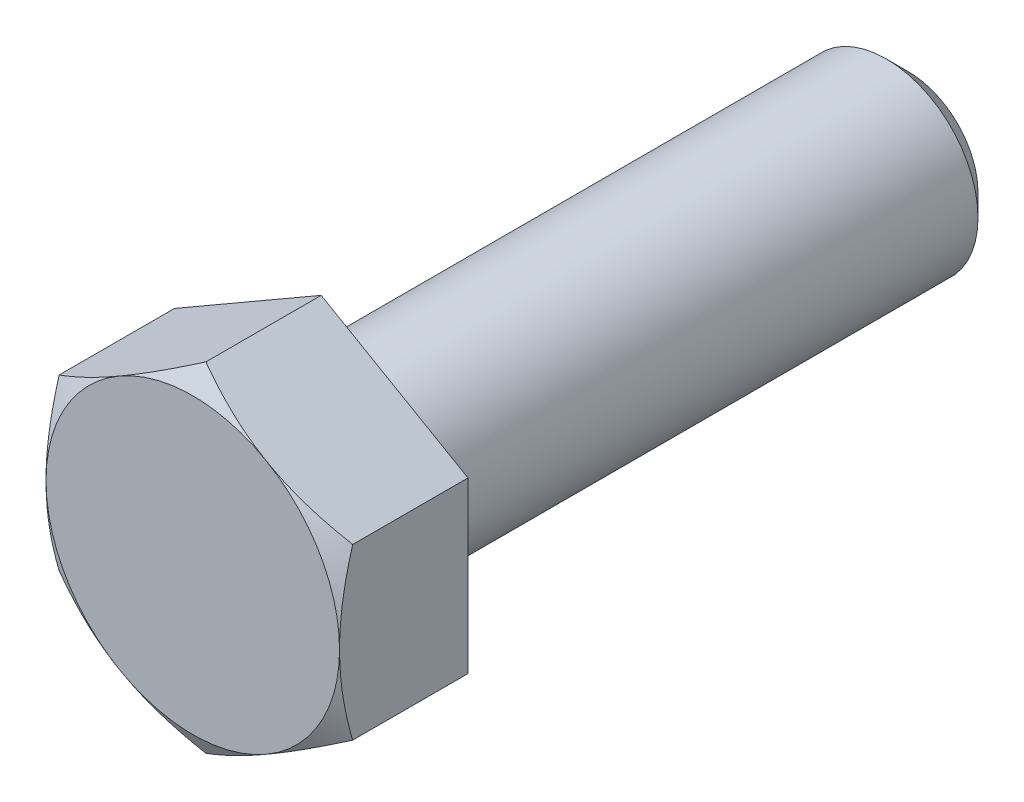
ISO-10303-21;
HEADER;
FILE_DESCRIPTION(('STEP AP214'),'2;1');
FILE_NAME('part.step','',(''),(''),'','','');
FILE_SCHEMA(('AUTOMOTIVE_DESIGN { 1 0 10303 214 1 1 1 1 }'));
ENDSEC;
DATA;
#1=APPLICATION_CONTEXT('core data for automotive mechanical design processes');
#2=APPLICATION_PROTOCOL_DEFINITION('international standard','automotive_design',2000,#1);
#3=PRODUCT_CONTEXT('',#1,'mechanical');
#4=PRODUCT('Part','Part','',(#3));
#5=PRODUCT_RELATED_PRODUCT_CATEGORY('part','',(#4));
#6=PRODUCT_DEFINITION_FORMATION('','',#4);
#7=PRODUCT_DEFINITION_CONTEXT('part definition',#1,'design');
#8=PRODUCT_DEFINITION('design','',#6,#7);
#9=PRODUCT_DEFINITION_SHAPE('','',#8);
#10=(LENGTH_UNIT() NAMED_UNIT(*) SI_UNIT(.MILLI.,.METRE.));
#11=(NAMED_UNIT(*) PLANE_ANGLE_UNIT() SI_UNIT($,.RADIAN.));
#12=(NAMED_UNIT(*) SI_UNIT($,.STERADIAN.) SOLID_ANGLE_UNIT());
#13=UNCERTAINTY_MEASURE_WITH_UNIT(LENGTH_MEASURE(1.E-05),#10,'distance_accuracy_value','');
#14=(GEOMETRIC_REPRESENTATION_CONTEXT(3) GLOBAL_UNCERTAINTY_ASSIGNED_CONTEXT((#13)) GLOBAL_UNIT_ASSIGNED_CONTEXT((#10,
#11,#12)) REPRESENTATION_CONTEXT('',''));
#15=CARTESIAN_POINT('',(0.,0.,0.));
#16=DIRECTION('',(0.,0.,1.));
#17=DIRECTION('',(1.,0.,0.));
#18=AXIS2_PLACEMENT_3D('',#15,#16,#17);
#19=CARTESIAN_POINT('',(3.99999999999999,2.30940107675851,-5.97020185321558));
#20=DIRECTION('',(0.5,0.866025403784439,0.));
#21=DIRECTION('',(-0.866025403784439,0.5,0.));
#22=AXIS2_PLACEMENT_3D('',#19,#20,#21);
#23=PLANE('',#22);
#24=DIRECTION('',(0.,0.,1.));
#25=VECTOR('',#24,1.);
#26=CARTESIAN_POINT('',(0.,4.61880215351701,-5.97020185321558));
#27=LINE('',#26,#25);
#28=CARTESIAN_POINT('',(0.,4.61880215351701,6.24999999999999));
#29=VERTEX_POINT('',#28);
#30=CARTESIAN_POINT('',(0.,4.61880215351701,9.39273441009183));
#31=VERTEX_POINT('',#30);
#32=EDGE_CURVE('E243',#29,#31,#27,.T.);
#33=ORIENTED_EDGE('',*,*,#32,.T.);
#34=CARTESIAN_POINT('',(-0.000199999999999906,4.61891762357085,9.39266774092523));
#35=CARTESIAN_POINT('',(0.175579150323229,4.51743148381381,9.45128212635171));
#36=CARTESIAN_POINT('',(0.352875616326381,4.41506932144052,9.50458967853773));
#37=CARTESIAN_POINT('',(0.710538593175707,4.2085725054774,9.59763832925359));
#38=CARTESIAN_POINT('',(0.890911458970152,4.10443418285647,9.63734651097029));
#39=CARTESIAN_POINT('',(1.24942181870279,3.89744813015756,9.69915778471971));
#40=CARTESIAN_POINT('',(1.42750415293514,3.7946322465506,9.7216722684771));
#41=CARTESIAN_POINT('',(1.78450671716651,3.58851671999023,9.74854937685341));
#42=CARTESIAN_POINT('',(1.9634256496441,3.48521782616117,9.75293425857305));
#43=CARTESIAN_POINT('',(2.29774284219673,3.29219970504619,9.74380992706002));
#44=CARTESIAN_POINT('',(2.45319115998707,3.20245157692487,9.732541046012));
#45=CARTESIAN_POINT('',(2.76307505563505,3.02354002635497,9.6968260092018));
#46=CARTESIAN_POINT('',(2.91750956174413,2.93437722268073,9.67236765428846));
#47=CARTESIAN_POINT('',(3.22803232777458,2.75509682012355,9.61122393508071));
#48=CARTESIAN_POINT('',(3.3840812880631,2.66500191089421,9.57427939634513));
#49=CARTESIAN_POINT('',(3.69385183540383,2.48615580200002,9.49042992745197));
#50=CARTESIAN_POINT('',(3.84757739077377,2.39740231122586,9.44354469778726));
#51=CARTESIAN_POINT('',(4.00019999999999,2.30928560670468,9.39266774092523));
#52=B_SPLINE_CURVE_WITH_KNOTS('',3,(#34,#35,#36,#37,#38,#39,#40,#41,#42,#43,#44,#45,#46,#47,#48,
#49,#50,#51),.UNSPECIFIED.,.F.,.F.,(4,2,2,2,2,2,2,2,4),(0.,0.634047835695966,1.26961969224543,
1.88946157213122,2.50854226669297,3.04757825393386,3.58711366126903,4.13861653143763,
4.68903648037742),.UNSPECIFIED.);
#53=CARTESIAN_POINT('',(2.,3.46410161513776,9.74999999999999));
#54=VERTEX_POINT('',#53);
#55=EDGE_CURVE('E246',#31,#54,#52,.T.);
#56=ORIENTED_EDGE('',*,*,#55,.T.);
#57=CARTESIAN_POINT('',(3.99999999999999,2.30940107675851,9.39273441009184));
#58=VERTEX_POINT('',#57);
#59=EDGE_CURVE('E57',#54,#58,#52,.T.);
#60=ORIENTED_EDGE('',*,*,#59,.T.);
#61=DIRECTION('',(0.,0.,1.));
#62=VECTOR('',#61,1.);
#63=CARTESIAN_POINT('',(3.99999999999999,2.30940107675851,-5.97020185321558));
#64=LINE('',#63,#62);
#65=CARTESIAN_POINT('',(3.99999999999999,2.30940107675851,6.24999999999999));
#66=VERTEX_POINT('',#65);
#67=EDGE_CURVE('E254',#66,#58,#64,.T.);
#68=ORIENTED_EDGE('',*,*,#67,.F.);
#69=DIRECTION('',(0.866025403784439,-0.5,0.));
#70=VECTOR('',#69,1.);
#71=CARTESIAN_POINT('',(3.99999999999999,2.30940107675851,6.24999999999999));
#72=LINE('',#71,#70);
#73=EDGE_CURVE('E242',#29,#66,#72,.T.);
#74=ORIENTED_EDGE('',*,*,#73,.F.);
#75=EDGE_LOOP('',(#33,#56,#60,#68,#74));
#76=FACE_BOUND('',#75,.T.);
#77=ADVANCED_FACE('F34',(#76),#23,.T.);
#78=CARTESIAN_POINT('',(3.99999999999999,-2.3094010767585,-5.97020185321558));
#79=DIRECTION('',(1.,0.,0.));
#80=DIRECTION('',(0.,1.,0.));
#81=AXIS2_PLACEMENT_3D('',#78,#79,#80);
#82=PLANE('',#81);
#83=ORIENTED_EDGE('',*,*,#67,.T.);
#84=CARTESIAN_POINT('',(4.,-6.32016209801659,7.74105073798309));
#85=CARTESIAN_POINT('',(4.,-6.14442150315513,7.8267639241729));
#86=CARTESIAN_POINT('',(4.,-5.96828977411648,7.91168830082252));
#87=CARTESIAN_POINT('',(4.,-5.61503643262633,8.07951794002602));
#88=CARTESIAN_POINT('',(4.,-5.43791467924549,8.1624229056288));
#89=CARTESIAN_POINT('',(4.,-5.08161610605796,8.32616457315393));
#90=CARTESIAN_POINT('',(4.,-4.90243340876014,8.40698852801391));
#91=CARTESIAN_POINT('',(4.,-4.54268291186545,8.5654807125113));
#92=CARTESIAN_POINT('',(4.,-4.36211517492714,8.64314908391657));
#93=CARTESIAN_POINT('',(4.,-3.99309047157056,8.79709428887914));
#94=CARTESIAN_POINT('',(4.,-3.80457523512599,8.87323217448639));
#95=CARTESIAN_POINT('',(4.,-3.42538286965878,9.02002330438741));
#96=CARTESIAN_POINT('',(3.99999999999999,-3.23470550722421,9.09067594993672));
#97=CARTESIAN_POINT('',(3.99999999999999,-2.85120603982111,9.22472722018248));
#98=CARTESIAN_POINT('',(3.99999999999999,-2.65838877746568,9.28813956501231));
#99=CARTESIAN_POINT('',(3.99999999999999,-2.26999073996686,9.4057532296135));
#100=CARTESIAN_POINT('',(3.99999999999999,-2.07441081817725,9.45995732911213));
#101=CARTESIAN_POINT('',(3.99999999999999,-1.68146389205672,9.5563423885688));
#102=CARTESIAN_POINT('',(3.99999999999999,-1.48411388932555,9.5985914199227));
#103=CARTESIAN_POINT('',(3.99999999999999,-1.0868420599797,9.66875684631887));
#104=CARTESIAN_POINT('',(3.99999999999999,-0.886920520852777,9.69667482948392));
#105=CARTESIAN_POINT('',(3.99999999999999,-0.488161424145341,9.7355919440407));
#106=CARTESIAN_POINT('',(3.99999999999999,-0.289346536349984,9.74681761296142));
#107=CARTESIAN_POINT('',(3.99999999999999,0.108530479240794,9.75200277841966));
#108=CARTESIAN_POINT('',(3.99999999999999,0.307592610011751,9.74596206510608));
#109=CARTESIAN_POINT('',(3.99999999999999,0.64213047897217,9.72173841887487));
#110=CARTESIAN_POINT('',(3.99999999999999,0.777947624370124,9.70796321162285));
#111=CARTESIAN_POINT('',(3.99999999999999,1.04865723387795,9.67317125583413));
#112=CARTESIAN_POINT('',(3.99999999999999,1.18354958273125,9.65215362083084));
#113=CARTESIAN_POINT('',(3.99999999999999,1.58661718796204,9.57933470482305));
#114=CARTESIAN_POINT('',(3.99999999999999,1.8530534932555,9.51777809699626));
#115=CARTESIAN_POINT('',(3.99999999999999,2.25169313027202,9.41013293137707));
#116=CARTESIAN_POINT('',(3.99999999999999,2.38593642938497,9.37116080345818));
#117=CARTESIAN_POINT('',(3.99999999999999,2.65312123317769,9.28894485955159));
#118=CARTESIAN_POINT('',(3.99999999999999,2.78606272758974,9.24570100990139));
#119=CARTESIAN_POINT('',(3.99999999999999,3.05068342222702,9.15565399708689));
#120=CARTESIAN_POINT('',(3.99999999999999,3.18236295379027,9.10885179872179));
#121=CARTESIAN_POINT('',(3.99999999999999,3.4446147402704,9.01226098428997));
#122=CARTESIAN_POINT('',(3.99999999999999,3.57518702223429,8.96247244141252));
#123=CARTESIAN_POINT('',(3.99999999999999,3.93177799360221,8.82257226134256));
#124=CARTESIAN_POINT('',(3.99999999999999,4.15680216474522,8.7299278724412));
#125=CARTESIAN_POINT('',(3.99999999999999,4.60447895340815,8.53905562556486));
#126=CARTESIAN_POINT('',(3.99999999999999,4.82713128514795,8.44082710360062));
#127=CARTESIAN_POINT('',(3.99999999999999,5.27061186633369,8.24013448610209));
#128=CARTESIAN_POINT('',(3.99999999999999,5.49143940746283,8.1376688307314));
#129=CARTESIAN_POINT('',(3.99999999999999,5.93157735291048,7.9295224713635));
#130=CARTESIAN_POINT('',(3.99999999999999,6.15088770820355,7.82384166406391));
#131=CARTESIAN_POINT('',(3.99999999999999,6.5886445296037,7.60980684262564));
#132=CARTESIAN_POINT('',(3.99999999999999,6.80708898145596,7.50144871747989));
#133=CARTESIAN_POINT('',(3.99999999999999,7.24298361258396,7.28274864350009));
#134=CARTESIAN_POINT('',(3.99999999999999,7.46043378098989,7.17240667304277));
#135=CARTESIAN_POINT('',(3.99999999999999,8.11147091374178,6.83907300701317));
#136=CARTESIAN_POINT('',(3.99999999999999,8.54384921852185,6.61372184602896));
#137=CARTESIAN_POINT('',(3.99999999999999,9.35956993070881,6.18353752711186));
#138=CARTESIAN_POINT('',(3.99999999999999,9.74313952406243,5.97913304777428));
#139=CARTESIAN_POINT('',(3.99999999999999,10.5090013099374,5.56788577484782));
#140=CARTESIAN_POINT('',(3.99999999999999,10.8912934164711,5.3610428212052));
#141=CARTESIAN_POINT('',(3.99999999999999,11.6535663630291,4.94628219002348));
#142=CARTESIAN_POINT('',(3.99999999999999,12.0335506144733,4.73837077233012));
#143=CARTESIAN_POINT('',(3.99999999999999,12.7927224952555,4.32117247452796));
#144=CARTESIAN_POINT('',(3.99999999999999,13.1719101881454,4.11188571011096));
#145=CARTESIAN_POINT('',(3.99999999999999,13.5508195884325,3.90209940855465));
#146=B_SPLINE_CURVE_WITH_KNOTS('',3,(#84,#85,#86,#87,#88,#89,#90,#91,#92,#93,#94,#95,#96,#97,
#98,#99,#100,#101,#102,#103,#104,#105,#106,#107,#108,#109,#110,#111,#112,#113,#114,#115,#116,
#117,#118,#119,#120,#121,#122,#123,#124,#125,#126,#127,#128,#129,#130,#131,#132,#133,#134,#135,
#136,#137,#138,#139,#140,#141,#142,#143,#144,#145),.UNSPECIFIED.,.F.,.F.,(4,2,2,2,2,2,2,2,2,2,2,
2,2,2,2,2,2,2,2,2,2,2,2,2,2,2,2,2,2,2,4),(0.,0.586592991088322,1.17327172525872,
1.76295108626189,2.35260392594492,2.96246800180305,3.57239855439457,4.18115342209003,
4.78972419487395,5.39475667832658,5.99972209945396,6.59639989929893,7.19308495104091,
7.60243042184657,8.01182601397386,8.83100525983565,9.25032402929616,9.66964610338252,
10.0888548865296,10.5080533999096,11.2379871833721,11.9680079429301,12.6982998837268,
13.4286153135334,14.1601319730136,14.8916566106255,16.3543555690378,17.6582491062665,
18.9622287087901,20.2616627616664,21.5609888729424),.UNSPECIFIED.);
#147=CARTESIAN_POINT('',(4.,0.,9.74999999999999));
#148=VERTEX_POINT('',#147);
#149=EDGE_CURVE('E286',#58,#148,#146,.F.);
#150=ORIENTED_EDGE('',*,*,#149,.T.);
#151=CARTESIAN_POINT('',(3.99999999999999,-2.3094010767585,9.39273441009184));
#152=VERTEX_POINT('',#151);
#153=EDGE_CURVE('E183',#148,#152,#146,.F.);
#154=ORIENTED_EDGE('',*,*,#153,.T.);
#155=DIRECTION('',(0.,0.,1.));
#156=VECTOR('',#155,1.);
#157=CARTESIAN_POINT('',(3.99999999999999,-2.3094010767585,-5.97020185321558));
#158=LINE('',#157,#156);
#159=CARTESIAN_POINT('',(3.99999999999999,-2.3094010767585,6.24999999999999));
#160=VERTEX_POINT('',#159);
#161=EDGE_CURVE('E251',#160,#152,#158,.T.);
#162=ORIENTED_EDGE('',*,*,#161,.F.);
#163=DIRECTION('',(0.,-1.,0.));
#164=VECTOR('',#163,1.);
#165=CARTESIAN_POINT('',(3.99999999999999,-2.3094010767585,6.24999999999999));
#166=LINE('',#165,#164);
#167=EDGE_CURVE('E259',#66,#160,#166,.T.);
#168=ORIENTED_EDGE('',*,*,#167,.F.);
#169=EDGE_LOOP('',(#83,#150,#154,#162,#168));
#170=FACE_BOUND('',#169,.T.);
#171=ADVANCED_FACE('F160',(#170),#82,.T.);
#172=CARTESIAN_POINT('',(0.,-4.618802153517,-5.97020185321558));
#173=DIRECTION('',(0.500000000000001,-0.866025403784438,0.));
#174=DIRECTION('',(0.866025403784438,0.500000000000001,0.));
#175=AXIS2_PLACEMENT_3D('',#172,#173,#174);
#176=PLANE('',#175);
#177=ORIENTED_EDGE('',*,*,#161,.T.);
#178=CARTESIAN_POINT('',(4.00019999999999,-2.30928560670466,9.39266774092523));
#179=CARTESIAN_POINT('',(3.82442084967677,-2.4107717464617,9.45128212635172));
#180=CARTESIAN_POINT('',(3.64712438367361,-2.51313390883499,9.50458967853774));
#181=CARTESIAN_POINT('',(3.28946140682429,-2.71963072479811,9.59763832925359));
#182=CARTESIAN_POINT('',(3.10908854102984,-2.82376904741904,9.63734651097029));
#183=CARTESIAN_POINT('',(2.75057818129721,-3.03075510011795,9.69915778471972));
#184=CARTESIAN_POINT('',(2.57249584706485,-3.13357098372492,9.72167226847711));
#185=CARTESIAN_POINT('',(2.21549328283349,-3.33968651028528,9.74854937685342));
#186=CARTESIAN_POINT('',(2.0365743503559,-3.44298540411434,9.75293425857305));
#187=CARTESIAN_POINT('',(1.70225715780327,-3.63600352522932,9.74380992706003));
#188=CARTESIAN_POINT('',(1.54680884001293,-3.72575165335064,9.732541046012));
#189=CARTESIAN_POINT('',(1.23692494436494,-3.90466320392054,9.6968260092018));
#190=CARTESIAN_POINT('',(1.08249043825587,-3.99382600759478,9.67236765428846));
#191=CARTESIAN_POINT('',(0.771967672225423,-4.17310641015197,9.61122393508071));
#192=CARTESIAN_POINT('',(0.6159187119369,-4.26320131938131,9.57427939634513));
#193=CARTESIAN_POINT('',(0.306148164596164,-4.4420474282755,9.49042992745197));
#194=CARTESIAN_POINT('',(0.152422609226225,-4.53080091904966,9.44354469778726));
#195=CARTESIAN_POINT('',(-0.000199999999995411,-4.61891762357084,9.39266774092523));
#196=B_SPLINE_CURVE_WITH_KNOTS('',3,(#178,#179,#180,#181,#182,#183,#184,#185,#186,#187,#188,
#189,#190,#191,#192,#193,#194,#195),.UNSPECIFIED.,.F.,.F.,(4,2,2,2,2,2,2,2,4),(0.,
0.634047835695965,1.26961969224543,1.88946157213122,2.50854226669297,3.04757825393385,
3.58711366126903,4.13861653143763,4.68903648037742),.UNSPECIFIED.);
#197=CARTESIAN_POINT('',(2.,-3.46410161513776,9.74999999999999));
#198=VERTEX_POINT('',#197);
#199=EDGE_CURVE('E182',#152,#198,#196,.T.);
#200=ORIENTED_EDGE('',*,*,#199,.T.);
#201=CARTESIAN_POINT('',(0.,-4.618802153517,9.39273441009184));
#202=VERTEX_POINT('',#201);
#203=EDGE_CURVE('E176',#198,#202,#196,.T.);
#204=ORIENTED_EDGE('',*,*,#203,.T.);
#205=DIRECTION('',(0.,0.,1.));
#206=VECTOR('',#205,1.);
#207=CARTESIAN_POINT('',(0.,-4.618802153517,-5.97020185321558));
#208=LINE('',#207,#206);
#209=CARTESIAN_POINT('',(0.,-4.618802153517,6.24999999999999));
#210=VERTEX_POINT('',#209);
#211=EDGE_CURVE('E249',#210,#202,#208,.T.);
#212=ORIENTED_EDGE('',*,*,#211,.F.);
#213=DIRECTION('',(-0.866025403784438,-0.500000000000001,0.));
#214=VECTOR('',#213,1.);
#215=CARTESIAN_POINT('',(0.,-4.618802153517,6.24999999999999));
#216=LINE('',#215,#214);
#217=EDGE_CURVE('E262',#160,#210,#216,.T.);
#218=ORIENTED_EDGE('',*,*,#217,.F.);
#219=EDGE_LOOP('',(#177,#200,#204,#212,#218));
#220=FACE_BOUND('',#219,.T.);
#221=ADVANCED_FACE('F188',(#220),#176,.T.);
#222=CARTESIAN_POINT('',(-4.,-2.3094010767585,-5.97020185321558));
#223=DIRECTION('',(-0.499999999999999,-0.866025403784439,0.));
#224=DIRECTION('',(0.866025403784439,-0.499999999999999,0.));
#225=AXIS2_PLACEMENT_3D('',#222,#223,#224);
#226=PLANE('',#225);
#227=ORIENTED_EDGE('',*,*,#211,.T.);
#228=CARTESIAN_POINT('',(0.000200000000004337,-4.61891762357084,9.39266774092523));
#229=CARTESIAN_POINT('',(-0.175579150323223,-4.5174314838138,9.45128212635172));
#230=CARTESIAN_POINT('',(-0.352875616326376,-4.41506932144051,9.50458967853774));
#231=CARTESIAN_POINT('',(-0.710538593175702,-4.20857250547739,9.59763832925359));
#232=CARTESIAN_POINT('',(-0.890911458970147,-4.10443418285646,9.63734651097029));
#233=CARTESIAN_POINT('',(-1.24942181870279,-3.89744813015756,9.69915778471972));
#234=CARTESIAN_POINT('',(-1.42750415293514,-3.79463224655059,9.72167226847711));
#235=CARTESIAN_POINT('',(-1.78450671716651,-3.58851671999023,9.74854937685342));
#236=CARTESIAN_POINT('',(-1.9634256496441,-3.48521782616117,9.75293425857305));
#237=CARTESIAN_POINT('',(-2.29774284219673,-3.29219970504619,9.74380992706003));
#238=CARTESIAN_POINT('',(-2.45319115998706,-3.20245157692486,9.732541046012));
#239=CARTESIAN_POINT('',(-2.76307505563505,-3.02354002635496,9.69682600920181));
#240=CARTESIAN_POINT('',(-2.91750956174413,-2.93437722268072,9.67236765428846));
#241=CARTESIAN_POINT('',(-3.22803232777458,-2.75509682012354,9.61122393508071));
#242=CARTESIAN_POINT('',(-3.3840812880631,-2.6650019108942,9.57427939634513));
#243=CARTESIAN_POINT('',(-3.69385183540384,-2.486155802,9.49042992745197));
#244=CARTESIAN_POINT('',(-3.84757739077378,-2.39740231122584,9.44354469778726));
#245=CARTESIAN_POINT('',(-4.0002,-2.30928560670466,9.39266774092523));
#246=B_SPLINE_CURVE_WITH_KNOTS('',3,(#228,#229,#230,#231,#232,#233,#234,#235,#236,#237,#238,
#239,#240,#241,#242,#243,#244,#245),.UNSPECIFIED.,.F.,.F.,(4,2,2,2,2,2,2,2,4),(0.,
0.634047835695966,1.26961969224543,1.88946157213122,2.50854226669297,3.04757825393386,
3.58711366126904,4.13861653143764,4.68903648037744),.UNSPECIFIED.);
#247=CARTESIAN_POINT('',(-2.,-3.46410161513776,9.74999999999999));
#248=VERTEX_POINT('',#247);
#249=EDGE_CURVE('E134',#202,#248,#246,.T.);
#250=ORIENTED_EDGE('',*,*,#249,.T.);
#251=CARTESIAN_POINT('',(-4.,-2.30940107675864,9.39273441009192));
#252=VERTEX_POINT('',#251);
#253=EDGE_CURVE('E123',#248,#252,#246,.T.);
#254=ORIENTED_EDGE('',*,*,#253,.T.);
#255=DIRECTION('',(0.,0.,1.));
#256=VECTOR('',#255,1.);
#257=CARTESIAN_POINT('',(-4.,-2.3094010767585,-5.97020185321558));
#258=LINE('',#257,#256);
#259=CARTESIAN_POINT('',(-4.,-2.3094010767585,6.24999999999999));
#260=VERTEX_POINT('',#259);
#261=EDGE_CURVE('E133',#260,#252,#258,.T.);
#262=ORIENTED_EDGE('',*,*,#261,.F.);
#263=DIRECTION('',(-0.866025403784439,0.499999999999999,0.));
#264=VECTOR('',#263,1.);
#265=CARTESIAN_POINT('',(-4.,-2.3094010767585,6.24999999999999));
#266=LINE('',#265,#264);
#267=EDGE_CURVE('E265',#210,#260,#266,.T.);
#268=ORIENTED_EDGE('',*,*,#267,.F.);
#269=EDGE_LOOP('',(#227,#250,#254,#262,#268));
#270=FACE_BOUND('',#269,.T.);
#271=ADVANCED_FACE('F191',(#270),#226,.T.);
#272=CARTESIAN_POINT('',(-4.,2.3094010767585,-5.97020185321558));
#273=DIRECTION('',(-1.,0.,0.));
#274=DIRECTION('',(0.,-1.,0.));
#275=AXIS2_PLACEMENT_3D('',#272,#273,#274);
#276=PLANE('',#275);
#277=ORIENTED_EDGE('',*,*,#261,.T.);
#278=CARTESIAN_POINT('',(-4.00000000000001,-6.3201620980166,7.74105073798308));
#279=CARTESIAN_POINT('',(-4.00000000000001,-6.14442150315514,7.82676392417289));
#280=CARTESIAN_POINT('',(-4.00000000000001,-5.96828977411649,7.91168830082251));
#281=CARTESIAN_POINT('',(-4.00000000000001,-5.61503643262633,8.07951794002602));
#282=CARTESIAN_POINT('',(-4.00000000000001,-5.4379146792455,8.1624229056288));
#283=CARTESIAN_POINT('',(-4.00000000000001,-5.08161610605796,8.32616457315392));
#284=CARTESIAN_POINT('',(-4.00000000000001,-4.90243340876015,8.4069885280139));
#285=CARTESIAN_POINT('',(-4.00000000000001,-4.54268291186545,8.56548071251129));
#286=CARTESIAN_POINT('',(-4.00000000000001,-4.36211517492715,8.64314908391656));
#287=CARTESIAN_POINT('',(-4.00000000000001,-3.99309047157057,8.79709428887913));
#288=CARTESIAN_POINT('',(-4.,-3.804575235126,8.87323217448638));
#289=CARTESIAN_POINT('',(-4.,-3.42538286965878,9.02002330438741));
#290=CARTESIAN_POINT('',(-4.,-3.23470550722421,9.09067594993671));
#291=CARTESIAN_POINT('',(-4.,-2.85120603982111,9.22472722018247));
#292=CARTESIAN_POINT('',(-4.,-2.65838877746568,9.28813956501231));
#293=CARTESIAN_POINT('',(-4.,-2.26999073996686,9.40575322961349));
#294=CARTESIAN_POINT('',(-4.,-2.07441081817725,9.45995732911213));
#295=CARTESIAN_POINT('',(-4.,-1.68146389205672,9.55634238856879));
#296=CARTESIAN_POINT('',(-4.,-1.48411388932555,9.59859141992269));
#297=CARTESIAN_POINT('',(-4.,-1.08684205997969,9.66875684631886));
#298=CARTESIAN_POINT('',(-4.,-0.886920520852773,9.69667482948392));
#299=CARTESIAN_POINT('',(-4.,-0.488161424145336,9.7355919440407));
#300=CARTESIAN_POINT('',(-4.,-0.289346536349978,9.74681761296141));
#301=CARTESIAN_POINT('',(-4.,0.108530479240801,9.75200277841966));
#302=CARTESIAN_POINT('',(-4.,0.307592610011758,9.74596206510608));
#303=CARTESIAN_POINT('',(-4.,0.642130478972178,9.72173841887487));
#304=CARTESIAN_POINT('',(-4.,0.777947624370132,9.70796321162285));
#305=CARTESIAN_POINT('',(-4.,1.04865723387796,9.67317125583413));
#306=CARTESIAN_POINT('',(-4.,1.18354958273126,9.65215362083084));
#307=CARTESIAN_POINT('',(-4.,1.58661718796205,9.57933470482305));
#308=CARTESIAN_POINT('',(-4.,1.85305349325551,9.51777809699625));
#309=CARTESIAN_POINT('',(-4.,2.25169313027203,9.41013293137707));
#310=CARTESIAN_POINT('',(-4.,2.38593642938499,9.37116080345817));
#311=CARTESIAN_POINT('',(-4.,2.6531212331777,9.28894485955158));
#312=CARTESIAN_POINT('',(-4.,2.78606272758976,9.24570100990138));
#313=CARTESIAN_POINT('',(-4.,3.05068342222703,9.15565399708689));
#314=CARTESIAN_POINT('',(-4.,3.18236295379028,9.10885179872179));
#315=CARTESIAN_POINT('',(-4.,3.44461474027041,9.01226098428996));
#316=CARTESIAN_POINT('',(-4.,3.5751870222343,8.96247244141251));
#317=CARTESIAN_POINT('',(-4.,3.93177799360222,8.82257226134255));
#318=CARTESIAN_POINT('',(-4.,4.15680216474523,8.72992787244119));
#319=CARTESIAN_POINT('',(-4.,4.60447895340816,8.53905562556485));
#320=CARTESIAN_POINT('',(-4.,4.82713128514796,8.44082710360061));
#321=CARTESIAN_POINT('',(-4.,5.2706118663337,8.24013448610208));
#322=CARTESIAN_POINT('',(-4.,5.49143940746284,8.13766883073139));
#323=CARTESIAN_POINT('',(-4.,5.93157735291048,7.92952247136349));
#324=CARTESIAN_POINT('',(-4.,6.15088770820355,7.8238416640639));
#325=CARTESIAN_POINT('',(-4.,6.5886445296037,7.60980684262563));
#326=CARTESIAN_POINT('',(-4.,6.80708898145596,7.50144871747989));
#327=CARTESIAN_POINT('',(-4.,7.24298361258396,7.28274864350009));
#328=CARTESIAN_POINT('',(-4.,7.46043378098989,7.17240667304276));
#329=CARTESIAN_POINT('',(-3.99999999999999,8.11147091374178,6.83907300701317));
#330=CARTESIAN_POINT('',(-3.99999999999999,8.54384921852185,6.61372184602896));
#331=CARTESIAN_POINT('',(-3.99999999999999,9.35956993070881,6.18353752711186));
#332=CARTESIAN_POINT('',(-3.99999999999999,9.74313952406243,5.97913304777428));
#333=CARTESIAN_POINT('',(-3.99999999999999,10.5090013099375,5.56788577484782));
#334=CARTESIAN_POINT('',(-3.99999999999999,10.8912934164711,5.3610428212052));
#335=CARTESIAN_POINT('',(-3.99999999999999,11.6535663630291,4.94628219002348));
#336=CARTESIAN_POINT('',(-3.99999999999999,12.0335506144733,4.73837077233011));
#337=CARTESIAN_POINT('',(-3.99999999999999,12.7927224952555,4.32117247452796));
#338=CARTESIAN_POINT('',(-3.99999999999999,13.1719101881454,4.11188571011096));
#339=CARTESIAN_POINT('',(-3.99999999999999,13.5508195884325,3.90209940855465));
#340=B_SPLINE_CURVE_WITH_KNOTS('',3,(#278,#279,#280,#281,#282,#283,#284,#285,#286,#287,#288,
#289,#290,#291,#292,#293,#294,#295,#296,#297,#298,#299,#300,#301,#302,#303,#304,#305,#306,#307,
#308,#309,#310,#311,#312,#313,#314,#315,#316,#317,#318,#319,#320,#321,#322,#323,#324,#325,#326,
#327,#328,#329,#330,#331,#332,#333,#334,#335,#336,#337,#338,#339),.UNSPECIFIED.,.F.,.F.,(4,2,2,
2,2,2,2,2,2,2,2,2,2,2,2,2,2,2,2,2,2,2,2,2,2,2,2,2,2,2,4),(0.,0.586592991088322,1.17327172525872,
1.7629510862619,2.35260392594492,2.96246800180305,3.57239855439457,4.18115342209004,
4.78972419487396,5.39475667832659,5.99972209945398,6.59639989929894,7.19308495104093,
7.60243042184659,8.01182601397387,8.83100525983567,9.25032402929618,9.66964610338254,
10.0888548865296,10.5080533999096,11.2379871833721,11.9680079429301,12.6982998837268,
13.4286153135334,14.1601319730136,14.8916566106255,16.3543555690378,17.6582491062666,
18.9622287087901,20.2616627616664,21.5609888729424),.UNSPECIFIED.);
#341=CARTESIAN_POINT('',(-4.,0.,9.74999999999999));
#342=VERTEX_POINT('',#341);
#343=EDGE_CURVE('E116',#252,#342,#340,.T.);
#344=ORIENTED_EDGE('',*,*,#343,.T.);
#345=CARTESIAN_POINT('',(-4.,2.3094010767585,9.39273441009183));
#346=VERTEX_POINT('',#345);
#347=EDGE_CURVE('E105',#342,#346,#340,.T.);
#348=ORIENTED_EDGE('',*,*,#347,.T.);
#349=DIRECTION('',(0.,0.,1.));
#350=VECTOR('',#349,1.);
#351=CARTESIAN_POINT('',(-4.,2.3094010767585,-5.97020185321558));
#352=LINE('',#351,#350);
#353=CARTESIAN_POINT('',(-4.,2.3094010767585,6.24999999999999));
#354=VERTEX_POINT('',#353);
#355=EDGE_CURVE('E245',#354,#346,#352,.T.);
#356=ORIENTED_EDGE('',*,*,#355,.F.);
#357=DIRECTION('',(0.,1.,0.));
#358=VECTOR('',#357,1.);
#359=CARTESIAN_POINT('',(-4.,2.3094010767585,6.24999999999999));
#360=LINE('',#359,#358);
#361=EDGE_CURVE('E257',#260,#354,#360,.T.);
#362=ORIENTED_EDGE('',*,*,#361,.F.);
#363=EDGE_LOOP('',(#277,#344,#348,#356,#362));
#364=FACE_BOUND('',#363,.T.);
#365=ADVANCED_FACE('F131',(#364),#276,.T.);
#366=CARTESIAN_POINT('',(0.,4.61880215351701,-5.97020185321558));
#367=DIRECTION('',(-0.500000000000001,0.866025403784438,0.));
#368=DIRECTION('',(-0.866025403784438,-0.500000000000001,0.));
#369=AXIS2_PLACEMENT_3D('',#366,#367,#368);
#370=PLANE('',#369);
#371=ORIENTED_EDGE('',*,*,#355,.T.);
#372=CARTESIAN_POINT('',(-4.0002,2.30928560670467,9.39266774092523));
#373=CARTESIAN_POINT('',(-3.82442084967677,2.41077174646171,9.45128212635171));
#374=CARTESIAN_POINT('',(-3.64712438367362,2.513133908835,9.50458967853773));
#375=CARTESIAN_POINT('',(-3.28946140682429,2.71963072479812,9.59763832925359));
#376=CARTESIAN_POINT('',(-3.10908854102985,2.82376904741904,9.63734651097029));
#377=CARTESIAN_POINT('',(-2.75057818129721,3.03075510011795,9.69915778471972));
#378=CARTESIAN_POINT('',(-2.57249584706486,3.13357098372492,9.72167226847711));
#379=CARTESIAN_POINT('',(-2.21549328283349,3.33968651028529,9.74854937685341));
#380=CARTESIAN_POINT('',(-2.0365743503559,3.44298540411434,9.75293425857305));
#381=CARTESIAN_POINT('',(-1.70225715780327,3.63600352522933,9.74380992706002));
#382=CARTESIAN_POINT('',(-1.54680884001293,3.72575165335065,9.732541046012));
#383=CARTESIAN_POINT('',(-1.23692494436494,3.90466320392055,9.6968260092018));
#384=CARTESIAN_POINT('',(-1.08249043825587,3.99382600759479,9.67236765428846));
#385=CARTESIAN_POINT('',(-0.771967672225422,4.17310641015198,9.6112239350807));
#386=CARTESIAN_POINT('',(-0.615918711936897,4.26320131938132,9.57427939634513));
#387=CARTESIAN_POINT('',(-0.30614816459616,4.44204742827551,9.49042992745197));
#388=CARTESIAN_POINT('',(-0.152422609226221,4.53080091904967,9.44354469778725));
#389=CARTESIAN_POINT('',(0.000199999999999668,4.61891762357085,9.39266774092523));
#390=B_SPLINE_CURVE_WITH_KNOTS('',3,(#372,#373,#374,#375,#376,#377,#378,#379,#380,#381,#382,
#383,#384,#385,#386,#387,#388,#389),.UNSPECIFIED.,.F.,.F.,(4,2,2,2,2,2,2,2,4),(0.,
0.634047835695965,1.26961969224543,1.88946157213122,2.50854226669297,3.04757825393386,
3.58711366126903,4.13861653143764,4.68903648037743),.UNSPECIFIED.);
#391=CARTESIAN_POINT('',(-2.,3.46410161513775,9.74999999999999));
#392=VERTEX_POINT('',#391);
#393=EDGE_CURVE('E111',#346,#392,#390,.T.);
#394=ORIENTED_EDGE('',*,*,#393,.T.);
#395=EDGE_CURVE('E50',#392,#31,#390,.T.);
#396=ORIENTED_EDGE('',*,*,#395,.T.);
#397=ORIENTED_EDGE('',*,*,#32,.F.);
#398=DIRECTION('',(0.866025403784438,0.500000000000001,0.));
#399=VECTOR('',#398,1.);
#400=CARTESIAN_POINT('',(0.,4.61880215351701,6.24999999999999));
#401=LINE('',#400,#399);
#402=EDGE_CURVE('E239',#354,#29,#401,.T.);
#403=ORIENTED_EDGE('',*,*,#402,.F.);
#404=EDGE_LOOP('',(#371,#394,#396,#397,#403));
#405=FACE_BOUND('',#404,.T.);
#406=ADVANCED_FACE('F199',(#405),#370,.T.);
#407=CARTESIAN_POINT('',(0.,0.,-9.74999999999999));
#408=DIRECTION('',(0.,0.,1.));
#409=DIRECTION('',(1.,0.,0.));
#410=AXIS2_PLACEMENT_3D('',#407,#408,#409);
#411=PLANE('',#410);
#412=CARTESIAN_POINT('',(0.,0.,-9.74999999999998));
#413=DIRECTION('',(0.,0.,1.));
#414=DIRECTION('',(1.,0.,0.));
#415=AXIS2_PLACEMENT_3D('',#412,#413,#414);
#416=CIRCLE('',#415,1.9);
#417=CARTESIAN_POINT('',(1.9,0.,-9.74999999999998));
#418=VERTEX_POINT('',#417);
#419=EDGE_CURVE('E128',#418,#418,#416,.T.);
#420=ORIENTED_EDGE('',*,*,#419,.F.);
#421=EDGE_LOOP('',(#420));
#422=FACE_BOUND('',#421,.T.);
#423=ADVANCED_FACE('F221',(#422),#411,.F.);
#424=CARTESIAN_POINT('',(0.,0.,-9.74999999999998));
#425=DIRECTION('',(0.,0.,1.));
#426=DIRECTION('',(1.,0.,0.));
#427=AXIS2_PLACEMENT_3D('',#424,#425,#426);
#428=CONICAL_SURFACE('',#427,1.9,0.785398163397457);
#429=CARTESIAN_POINT('',(0.,0.,-9.14999999999999));
#430=DIRECTION('',(0.,0.,1.));
#431=DIRECTION('',(1.,0.,0.));
#432=AXIS2_PLACEMENT_3D('',#429,#430,#431);
#433=CIRCLE('',#432,2.5);
#434=CARTESIAN_POINT('',(2.5,0.,-9.14999999999999));
#435=VERTEX_POINT('',#434);
#436=EDGE_CURVE('E232',#435,#435,#433,.T.);
#437=ORIENTED_EDGE('',*,*,#436,.F.);
#438=EDGE_LOOP('',(#437));
#439=FACE_BOUND('',#438,.T.);
#440=ORIENTED_EDGE('',*,*,#419,.T.);
#441=EDGE_LOOP('',(#440));
#442=FACE_BOUND('',#441,.T.);
#443=ADVANCED_FACE('F218',(#439,#442),#428,.T.);
#444=CARTESIAN_POINT('',(0.,0.,9.74999999999999));
#445=DIRECTION('',(0.,0.,1.));
#446=DIRECTION('',(1.,0.,0.));
#447=AXIS2_PLACEMENT_3D('',#444,#445,#446);
#448=CYLINDRICAL_SURFACE('',#447,2.5);
#449=CARTESIAN_POINT('',(0.,0.,6.24999999999999));
#450=DIRECTION('',(0.,0.,1.));
#451=DIRECTION('',(1.,0.,0.));
#452=AXIS2_PLACEMENT_3D('',#449,#450,#451);
#453=CIRCLE('',#452,2.5);
#454=CARTESIAN_POINT('',(2.5,0.,6.24999999999999));
#455=VERTEX_POINT('',#454);
#456=EDGE_CURVE('E234',#455,#455,#453,.T.);
#457=ORIENTED_EDGE('',*,*,#456,.F.);
#458=EDGE_LOOP('',(#457));
#459=FACE_BOUND('',#458,.T.);
#460=ORIENTED_EDGE('',*,*,#436,.T.);
#461=EDGE_LOOP('',(#460));
#462=FACE_BOUND('',#461,.T.);
#463=ADVANCED_FACE('F214',(#459,#462),#448,.T.);
#464=CARTESIAN_POINT('',(0.,2.5,6.24999999999999));
#465=DIRECTION('',(0.,0.,1.));
#466=DIRECTION('',(1.,0.,0.));
#467=AXIS2_PLACEMENT_3D('',#464,#465,#466);
#468=PLANE('',#467);
#469=ORIENTED_EDGE('',*,*,#402,.T.);
#470=ORIENTED_EDGE('',*,*,#73,.T.);
#471=ORIENTED_EDGE('',*,*,#167,.T.);
#472=ORIENTED_EDGE('',*,*,#217,.T.);
#473=ORIENTED_EDGE('',*,*,#267,.T.);
#474=ORIENTED_EDGE('',*,*,#361,.T.);
#475=EDGE_LOOP('',(#469,#470,#471,#472,#473,#474));
#476=FACE_BOUND('',#475,.T.);
#477=ORIENTED_EDGE('',*,*,#456,.T.);
#478=EDGE_LOOP('',(#477));
#479=FACE_BOUND('',#478,.T.);
#480=ADVANCED_FACE('F211',(#476,#479),#468,.F.);
#481=CARTESIAN_POINT('',(0.,0.,9.74999999999999));
#482=DIRECTION('',(0.,0.,-1.));
#483=DIRECTION('',(1.,0.,0.));
#484=AXIS2_PLACEMENT_3D('',#481,#482,#483);
#485=CONICAL_SURFACE('',#484,4.,1.0471975511966);
#486=CARTESIAN_POINT('',(0.,0.,9.74999999999999));
#487=DIRECTION('',(0.,0.,-1.));
#488=DIRECTION('',(-1.,0.,0.));
#489=AXIS2_PLACEMENT_3D('',#486,#487,#488);
#490=CIRCLE('',#489,4.);
#491=EDGE_CURVE('E38',#248,#342,#490,.T.);
#492=ORIENTED_EDGE('',*,*,#491,.T.);
#493=ORIENTED_EDGE('',*,*,#343,.F.);
#494=ORIENTED_EDGE('',*,*,#253,.F.);
#495=EDGE_LOOP('',(#492,#493,#494));
#496=FACE_BOUND('',#495,.T.);
#497=ADVANCED_FACE('F121',(#496),#485,.T.);
#498=EDGE_CURVE('E127',#198,#248,#490,.T.);
#499=ORIENTED_EDGE('',*,*,#498,.T.);
#500=ORIENTED_EDGE('',*,*,#249,.F.);
#501=ORIENTED_EDGE('',*,*,#203,.F.);
#502=EDGE_LOOP('',(#499,#500,#501));
#503=FACE_BOUND('',#502,.T.);
#504=ADVANCED_FACE('F279',(#503),#485,.T.);
#505=EDGE_CURVE('E282',#148,#198,#490,.T.);
#506=ORIENTED_EDGE('',*,*,#505,.T.);
#507=ORIENTED_EDGE('',*,*,#199,.F.);
#508=ORIENTED_EDGE('',*,*,#153,.F.);
#509=EDGE_LOOP('',(#506,#507,#508));
#510=FACE_BOUND('',#509,.T.);
#511=ADVANCED_FACE('F288',(#510),#485,.T.);
#512=CARTESIAN_POINT('',(0.,0.,9.74999999999999));
#513=DIRECTION('',(0.,0.,1.));
#514=DIRECTION('',(1.,0.,0.));
#515=AXIS2_PLACEMENT_3D('',#512,#513,#514);
#516=CIRCLE('',#515,4.);
#517=EDGE_CURVE('E284',#148,#54,#516,.T.);
#518=ORIENTED_EDGE('',*,*,#517,.F.);
#519=ORIENTED_EDGE('',*,*,#149,.F.);
#520=ORIENTED_EDGE('',*,*,#59,.F.);
#521=EDGE_LOOP('',(#518,#519,#520));
#522=FACE_BOUND('',#521,.T.);
#523=ADVANCED_FACE('F285',(#522),#485,.T.);
#524=ORIENTED_EDGE('',*,*,#395,.F.);
#525=EDGE_CURVE('E43',#392,#54,#490,.T.);
#526=ORIENTED_EDGE('',*,*,#525,.T.);
#527=ORIENTED_EDGE('',*,*,#55,.F.);
#528=EDGE_LOOP('',(#524,#526,#527));
#529=FACE_BOUND('',#528,.T.);
#530=ADVANCED_FACE('F159',(#529),#485,.T.);
#531=EDGE_CURVE('E12',#342,#392,#490,.T.);
#532=ORIENTED_EDGE('',*,*,#531,.T.);
#533=ORIENTED_EDGE('',*,*,#393,.F.);
#534=ORIENTED_EDGE('',*,*,#347,.F.);
#535=EDGE_LOOP('',(#532,#533,#534));
#536=FACE_BOUND('',#535,.T.);
#537=ADVANCED_FACE('F107',(#536),#485,.T.);
#538=CARTESIAN_POINT('',(0.,4.,9.74999999999999));
#539=DIRECTION('',(0.,0.,-1.));
#540=DIRECTION('',(-1.,0.,0.));
#541=AXIS2_PLACEMENT_3D('',#538,#539,#540);
#542=PLANE('',#541);
#543=ORIENTED_EDGE('',*,*,#531,.F.);
#544=ORIENTED_EDGE('',*,*,#491,.F.);
#545=ORIENTED_EDGE('',*,*,#498,.F.);
#546=ORIENTED_EDGE('',*,*,#505,.F.);
#547=ORIENTED_EDGE('',*,*,#517,.T.);
#548=ORIENTED_EDGE('',*,*,#525,.F.);
#549=EDGE_LOOP('',(#543,#544,#545,#546,#547,#548));
#550=FACE_BOUND('',#549,.T.);
#551=ADVANCED_FACE('F36',(#550),#542,.F.);
#552=CLOSED_SHELL('',(#77,#171,#221,#271,#365,#406,#423,#443,#463,#480,#497,#504,#511,#523,#530,
#537,#551));
#553=MANIFOLD_SOLID_BREP('B2',#552);
#554=ADVANCED_BREP_SHAPE_REPRESENTATION('',(#18,#553),#14);
#555=SHAPE_DEFINITION_REPRESENTATION(#9,#554);
ENDSEC;
END-ISO-10303-21;
